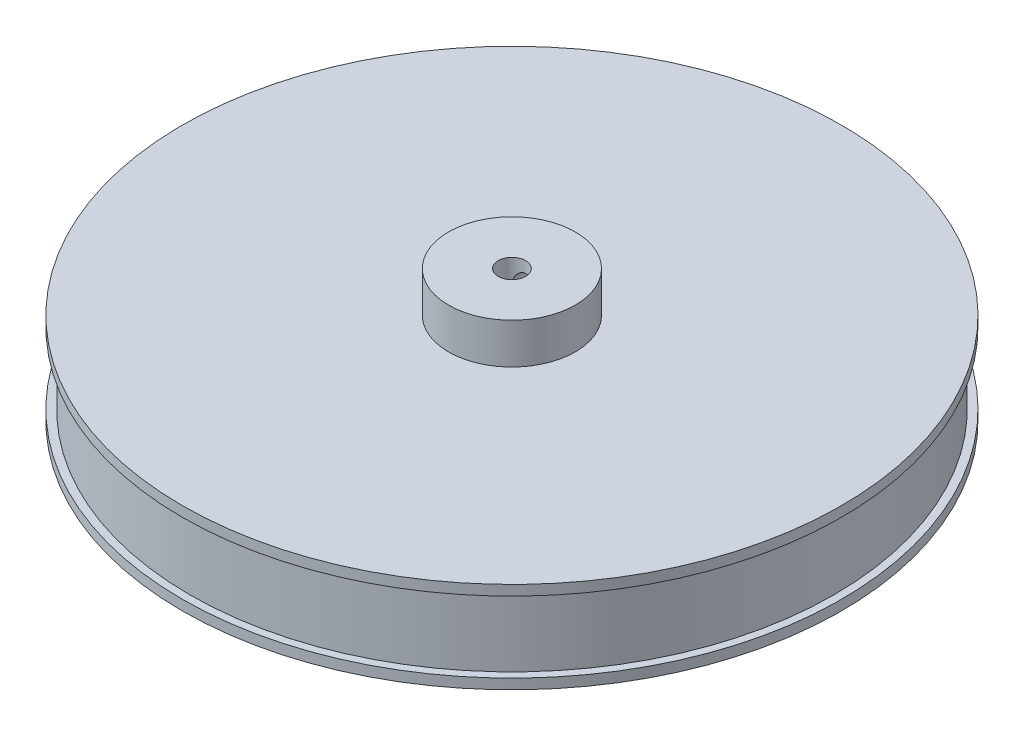
ISO-10303-21;
HEADER;
FILE_DESCRIPTION(('STEP AP214'),'2;1');
FILE_NAME('part.step','',(''),(''),'','','');
FILE_SCHEMA(('AUTOMOTIVE_DESIGN { 1 0 10303 214 1 1 1 1 }'));
ENDSEC;
DATA;
#1=APPLICATION_CONTEXT('core data for automotive mechanical design processes');
#2=APPLICATION_PROTOCOL_DEFINITION('international standard','automotive_design',2000,#1);
#3=PRODUCT_CONTEXT('',#1,'mechanical');
#4=PRODUCT('Part','Part','',(#3));
#5=PRODUCT_RELATED_PRODUCT_CATEGORY('part','',(#4));
#6=PRODUCT_DEFINITION_FORMATION('','',#4);
#7=PRODUCT_DEFINITION_CONTEXT('part definition',#1,'design');
#8=PRODUCT_DEFINITION('design','',#6,#7);
#9=PRODUCT_DEFINITION_SHAPE('','',#8);
#10=(LENGTH_UNIT() NAMED_UNIT(*) SI_UNIT(.MILLI.,.METRE.));
#11=(NAMED_UNIT(*) PLANE_ANGLE_UNIT() SI_UNIT($,.RADIAN.));
#12=(NAMED_UNIT(*) SI_UNIT($,.STERADIAN.) SOLID_ANGLE_UNIT());
#13=UNCERTAINTY_MEASURE_WITH_UNIT(LENGTH_MEASURE(1.E-05),#10,'distance_accuracy_value','');
#14=(GEOMETRIC_REPRESENTATION_CONTEXT(3) GLOBAL_UNCERTAINTY_ASSIGNED_CONTEXT((#13)) GLOBAL_UNIT_ASSIGNED_CONTEXT((#10,
#11,#12)) REPRESENTATION_CONTEXT('',''));
#15=CARTESIAN_POINT('',(0.,0.,0.));
#16=DIRECTION('',(0.,0.,1.));
#17=DIRECTION('',(1.,0.,0.));
#18=AXIS2_PLACEMENT_3D('',#15,#16,#17);
#19=CARTESIAN_POINT('',(0.,9.,0.));
#20=DIRECTION('',(0.,-1.,0.));
#21=DIRECTION('',(0.,0.,-1.));
#22=AXIS2_PLACEMENT_3D('',#19,#20,#21);
#23=CYLINDRICAL_SURFACE('',#22,32.5);
#24=CARTESIAN_POINT('',(0.,0.,0.));
#25=DIRECTION('',(0.,1.,0.));
#26=DIRECTION('',(0.,0.,1.));
#27=AXIS2_PLACEMENT_3D('',#24,#25,#26);
#28=CIRCLE('',#27,32.5);
#29=CARTESIAN_POINT('',(0.,0.,32.5));
#30=VERTEX_POINT('',#29);
#31=EDGE_CURVE('E56',#30,#30,#28,.T.);
#32=ORIENTED_EDGE('',*,*,#31,.T.);
#33=EDGE_LOOP('',(#32));
#34=FACE_BOUND('',#33,.T.);
#35=CARTESIAN_POINT('',(0.,1.,0.));
#36=DIRECTION('',(0.,1.,0.));
#37=DIRECTION('',(0.,0.,1.));
#38=AXIS2_PLACEMENT_3D('',#35,#36,#37);
#39=CIRCLE('',#38,32.5);
#40=CARTESIAN_POINT('',(0.,1.,32.5));
#41=VERTEX_POINT('',#40);
#42=EDGE_CURVE('E74',#41,#41,#39,.T.);
#43=ORIENTED_EDGE('',*,*,#42,.F.);
#44=EDGE_LOOP('',(#43));
#45=FACE_BOUND('',#44,.T.);
#46=ADVANCED_FACE('F44',(#34,#45),#23,.T.);
#47=CARTESIAN_POINT('',(0.,9.,0.));
#48=DIRECTION('',(0.,1.,0.));
#49=DIRECTION('',(0.,0.,1.));
#50=AXIS2_PLACEMENT_3D('',#47,#48,#49);
#51=CIRCLE('',#50,32.5);
#52=CARTESIAN_POINT('',(0.,9.,32.5));
#53=VERTEX_POINT('',#52);
#54=EDGE_CURVE('E11',#53,#53,#51,.T.);
#55=ORIENTED_EDGE('',*,*,#54,.F.);
#56=EDGE_LOOP('',(#55));
#57=FACE_BOUND('',#56,.T.);
#58=CARTESIAN_POINT('',(0.,8.,0.));
#59=DIRECTION('',(0.,1.,0.));
#60=DIRECTION('',(0.,0.,1.));
#61=AXIS2_PLACEMENT_3D('',#58,#59,#60);
#62=CIRCLE('',#61,32.5);
#63=CARTESIAN_POINT('',(0.,8.,32.5));
#64=VERTEX_POINT('',#63);
#65=EDGE_CURVE('E83',#64,#64,#62,.T.);
#66=ORIENTED_EDGE('',*,*,#65,.T.);
#67=EDGE_LOOP('',(#66));
#68=FACE_BOUND('',#67,.T.);
#69=ADVANCED_FACE('F125',(#57,#68),#23,.T.);
#70=CARTESIAN_POINT('',(0.,9.,0.));
#71=DIRECTION('',(0.,1.,0.));
#72=DIRECTION('',(0.,0.,1.));
#73=AXIS2_PLACEMENT_3D('',#70,#71,#72);
#74=PLANE('',#73);
#75=ORIENTED_EDGE('',*,*,#54,.T.);
#76=EDGE_LOOP('',(#75));
#77=FACE_BOUND('',#76,.T.);
#78=CARTESIAN_POINT('',(0.,9.,0.));
#79=DIRECTION('',(0.,1.,0.));
#80=DIRECTION('',(0.,0.,1.));
#81=AXIS2_PLACEMENT_3D('',#78,#79,#80);
#82=CIRCLE('',#81,6.25);
#83=CARTESIAN_POINT('',(0.,9.,6.25));
#84=VERTEX_POINT('',#83);
#85=EDGE_CURVE('E66',#84,#84,#82,.T.);
#86=ORIENTED_EDGE('',*,*,#85,.F.);
#87=EDGE_LOOP('',(#86));
#88=FACE_BOUND('',#87,.T.);
#89=ADVANCED_FACE('F130',(#77,#88),#74,.T.);
#90=CARTESIAN_POINT('',(0.,0.,0.));
#91=DIRECTION('',(0.,1.,0.));
#92=DIRECTION('',(0.,0.,1.));
#93=AXIS2_PLACEMENT_3D('',#90,#91,#92);
#94=PLANE('',#93);
#95=ORIENTED_EDGE('',*,*,#31,.F.);
#96=EDGE_LOOP('',(#95));
#97=FACE_BOUND('',#96,.T.);
#98=CARTESIAN_POINT('',(0.,0.,0.));
#99=DIRECTION('',(0.,1.,0.));
#100=DIRECTION('',(0.,0.,1.));
#101=AXIS2_PLACEMENT_3D('',#98,#99,#100);
#102=CIRCLE('',#101,1.35);
#103=CARTESIAN_POINT('',(0.,0.,1.35));
#104=VERTEX_POINT('',#103);
#105=EDGE_CURVE('E61',#104,#104,#102,.T.);
#106=ORIENTED_EDGE('',*,*,#105,.T.);
#107=EDGE_LOOP('',(#106));
#108=FACE_BOUND('',#107,.T.);
#109=ADVANCED_FACE('F143',(#97,#108),#94,.F.);
#110=CARTESIAN_POINT('',(0.,9.,0.));
#111=DIRECTION('',(0.,-1.,0.));
#112=DIRECTION('',(0.,0.,-1.));
#113=AXIS2_PLACEMENT_3D('',#110,#111,#112);
#114=CYLINDRICAL_SURFACE('',#113,1.35);
#115=CARTESIAN_POINT('',(0.,11.9,-1.35));
#116=CARTESIAN_POINT('',(-0.0452181225006576,11.9000002473346,-1.35000018740173));
#117=CARTESIAN_POINT('',(-0.0904360892098116,11.89657371352,-1.34770861239023));
#118=CARTESIAN_POINT('',(-0.17942987611425,11.8830814111524,-1.33877093590715));
#119=CARTESIAN_POINT('',(-0.223205001279751,11.8730124905945,-1.33212276711556));
#120=CARTESIAN_POINT('',(-0.307895538534414,11.8468515272038,-1.31512717082118));
#121=CARTESIAN_POINT('',(-0.3488232926959,11.8307876869964,-1.30479707471992));
#122=CARTESIAN_POINT('',(-0.427236880948767,11.7933214865278,-1.28126762044848));
#123=CARTESIAN_POINT('',(-0.464722214224351,11.7719183511647,-1.26806784572479));
#124=CARTESIAN_POINT('',(-0.53877811534655,11.7224043781847,-1.23852298216427));
#125=CARTESIAN_POINT('',(-0.575001137457305,11.6938784626657,-1.22200603910694));
#126=CARTESIAN_POINT('',(-0.642477620111733,11.6319214781037,-1.1879204088756));
#127=CARTESIAN_POINT('',(-0.673723824947495,11.598483381573,-1.17035023660574));
#128=CARTESIAN_POINT('',(-0.735400339854732,11.5215264345743,-1.13277719105458));
#129=CARTESIAN_POINT('',(-0.764924338632379,11.4772494560585,-1.11282780572009));
#130=CARTESIAN_POINT('',(-0.816076606563781,11.3832364800591,-1.07587866308767));
#131=CARTESIAN_POINT('',(-0.837718530419244,11.3335101192967,-1.05887383179594));
#132=CARTESIAN_POINT('',(-0.867033157551482,11.2444799179603,-1.03489319988662));
#133=CARTESIAN_POINT('',(-0.876935012562073,11.2063121962068,-1.02643932551596));
#134=CARTESIAN_POINT('',(-0.89167778003349,11.1283649728662,-1.01366086346807));
#135=CARTESIAN_POINT('',(-0.896527415933694,11.0885883730731,-1.00932915934812));
#136=CARTESIAN_POINT('',(-0.900861138635664,11.0083363495147,-1.00546472523675));
#137=CARTESIAN_POINT('',(-0.900323293129382,10.967858739447,-1.0059516115153));
#138=CARTESIAN_POINT('',(-0.893869115999575,10.8876642619246,-1.01168898967337));
#139=CARTESIAN_POINT('',(-0.887948227709805,10.8479480680853,-1.01694351728333));
#140=CARTESIAN_POINT('',(-0.87149247397984,10.7720898269431,-1.03107233696212));
#141=CARTESIAN_POINT('',(-0.861172701664503,10.7358673988346,-1.03977669748638));
#142=CARTESIAN_POINT('',(-0.836415533618551,10.6656393390538,-1.05979330317461));
#143=CARTESIAN_POINT('',(-0.82197678295292,10.6316344413662,-1.07110640624749));
#144=CARTESIAN_POINT('',(-0.786032184328487,10.559438572123,-1.09783888381991));
#145=CARTESIAN_POINT('',(-0.763686235479458,10.5218030449153,-1.11362543032056));
#146=CARTESIAN_POINT('',(-0.714010322102876,10.4503774722573,-1.14611192030235));
#147=CARTESIAN_POINT('',(-0.686674210536304,10.4165922540466,-1.16281297233852));
#148=CARTESIAN_POINT('',(-0.620915243903739,10.34635585443,-1.19944504675886));
#149=CARTESIAN_POINT('',(-0.581372722264049,10.3108996780799,-1.21929635119522));
#150=CARTESIAN_POINT('',(-0.49590359959843,10.2470615774706,-1.25648145304071));
#151=CARTESIAN_POINT('',(-0.44998303470765,10.2186730345691,-1.27381759942756));
#152=CARTESIAN_POINT('',(-0.36218602219104,10.1749350266172,-1.3011543183975));
#153=CARTESIAN_POINT('',(-0.321280939516711,10.1581204864968,-1.3119266752425));
#154=CARTESIAN_POINT('',(-0.236716219771616,10.1305527834692,-1.32978473563967));
#155=CARTESIAN_POINT('',(-0.193058945550942,10.1197944977907,-1.33687355457453));
#156=CARTESIAN_POINT('',(-0.103943453927328,10.1048774756427,-1.34674146970505));
#157=CARTESIAN_POINT('',(-0.0584783153702278,10.1007472425778,-1.34950195107544));
#158=CARTESIAN_POINT('',(0.0325986837250606,10.099438810147,-1.35037401734306));
#159=CARTESIAN_POINT('',(0.0782105337836021,10.1022601247799,-1.34848592723436));
#160=CARTESIAN_POINT('',(0.164905072742258,10.114230825003,-1.34054815241015));
#161=CARTESIAN_POINT('',(0.206080850106868,10.1229217839905,-1.33480010875949));
#162=CARTESIAN_POINT('',(0.286252376591097,10.1457180587052,-1.31993302177829));
#163=CARTESIAN_POINT('',(0.325247776902431,10.1598242379153,-1.31081344084846));
#164=CARTESIAN_POINT('',(0.402599137714553,10.1938935336727,-1.28923358639498));
#165=CARTESIAN_POINT('',(0.440773283102763,10.2141596693465,-1.27660441566389));
#166=CARTESIAN_POINT('',(0.513307360762144,10.2594949804662,-1.24920835019891));
#167=CARTESIAN_POINT('',(0.547664916620701,10.2845671222033,-1.23444013661991));
#168=CARTESIAN_POINT('',(0.617334504754488,10.3432735407155,-1.20129546016797));
#169=CARTESIAN_POINT('',(0.651938344392606,10.3776348172076,-1.1827177065154));
#170=CARTESIAN_POINT('',(0.715202856615432,10.4515001436282,-1.14557027969593));
#171=CARTESIAN_POINT('',(0.743859421488218,10.4910077175899,-1.12700062089573));
#172=CARTESIAN_POINT('',(0.792561494440452,10.5712140857479,-1.09322855535582));
#173=CARTESIAN_POINT('',(0.813130362704051,10.6115294151997,-1.07787418724401));
#174=CARTESIAN_POINT('',(0.848232962008492,10.6957426937617,-1.05047538491786));
#175=CARTESIAN_POINT('',(0.862777555613303,10.7396340222804,-1.03842500655803));
#176=CARTESIAN_POINT('',(0.883061295559844,10.8220540192083,-1.02119943667805));
#177=CARTESIAN_POINT('',(0.889913689039721,10.860127314436,-1.01517749105918));
#178=CARTESIAN_POINT('',(0.898646426663458,10.9372579766015,-1.00745759900923));
#179=CARTESIAN_POINT('',(0.900532171282927,10.9763142280161,-1.00575495606736));
#180=CARTESIAN_POINT('',(0.899207648916697,11.0542893755224,-1.00693890517272));
#181=CARTESIAN_POINT('',(0.895994364467314,11.0932081766133,-1.00982821461129));
#182=CARTESIAN_POINT('',(0.884686487499051,11.1698045878444,-1.01974703578796));
#183=CARTESIAN_POINT('',(0.876585382728908,11.2074804712374,-1.02678207076101));
#184=CARTESIAN_POINT('',(0.853168660520649,11.2905700338929,-1.04637079771435));
#185=CARTESIAN_POINT('',(0.836505842347787,11.3353704707326,-1.0598955016914));
#186=CARTESIAN_POINT('',(0.796880368327395,11.4209690753805,-1.08999972566247));
#187=CARTESIAN_POINT('',(0.773908867606882,11.4617615140716,-1.10658352375695));
#188=CARTESIAN_POINT('',(0.721792262425191,11.5396768492371,-1.14127733942752));
#189=CARTESIAN_POINT('',(0.692542394503446,11.5767194354473,-1.15940964321963));
#190=CARTESIAN_POINT('',(0.628522956159581,11.6458951152091,-1.19532735696594));
#191=CARTESIAN_POINT('',(0.593751694621459,11.6780266986612,-1.21311265875876));
#192=CARTESIAN_POINT('',(0.513655798389994,11.7410204469413,-1.24934198382353));
#193=CARTESIAN_POINT('',(0.467532751298392,11.7710383880808,-1.26751412452102));
#194=CARTESIAN_POINT('',(0.369390850098745,11.8225609744988,-1.29949949643766));
#195=CARTESIAN_POINT('',(0.317381428102524,11.8440789980706,-1.31331957050458));
#196=CARTESIAN_POINT('',(0.221145781425776,11.8735195601738,-1.3324574017653));
#197=CARTESIAN_POINT('',(0.177755546365983,11.8833999675944,-1.33898166166001));
#198=CARTESIAN_POINT('',(0.0895761054108604,11.8966376146421,-1.34775126063853));
#199=CARTESIAN_POINT('',(0.0447879762846266,11.8999997550182,-1.34999981438097));
#200=CARTESIAN_POINT('',(0.,11.9,-1.35));
#201=B_SPLINE_CURVE_WITH_KNOTS('',3,(#115,#116,#117,#118,#119,#120,#121,#122,#123,#124,#125,
#126,#127,#128,#129,#130,#131,#132,#133,#134,#135,#136,#137,#138,#139,#140,#141,#142,#143,#144,
#145,#146,#147,#148,#149,#150,#151,#152,#153,#154,#155,#156,#157,#158,#159,#160,#161,#162,#163,
#164,#165,#166,#167,#168,#169,#170,#171,#172,#173,#174,#175,#176,#177,#178,#179,#180,#181,#182,
#183,#184,#185,#186,#187,#188,#189,#190,#191,#192,#193,#194,#195,#196,#197,#198,#199,#200),
.UNSPECIFIED.,.T.,.F.,(4,2,2,2,2,2,2,2,2,2,2,2,2,2,2,2,2,2,2,2,2,2,2,2,2,2,2,2,2,2,2,2,2,2,2,2,
2,2,2,2,2,2,4),(0.,0.13547395192743,0.27101223645691,0.405920768935604,0.54084889740324,
0.687226630502506,0.833815852219433,1.00353007483192,1.17294887450447,1.29345162154213,
1.41374595530614,1.5345302028092,1.65541678768508,1.7709698798911,1.88656102712285,
2.02566408596817,2.16493966700291,2.33423529522804,2.50337178134878,2.63935839462806,
2.77522980813531,2.91168397481678,3.04812860189302,3.17498888155878,3.30186939811487,
3.43643556072547,3.57108504724607,3.72702679264224,3.88307588930298,4.02592470886672,
4.16851481985717,4.28545821604652,4.40227440147283,4.51915974125438,4.63620115730971,
4.78442973913351,4.9328672101627,5.08400660338209,5.23519237782759,5.40807908197664,
5.58069257948562,5.71497881111226,5.84916404062996),.UNSPECIFIED.);
#202=CARTESIAN_POINT('',(0.,11.9,-1.35));
#203=VERTEX_POINT('',#202);
#204=EDGE_CURVE('E86',#203,#203,#201,.T.);
#205=ORIENTED_EDGE('',*,*,#204,.F.);
#206=EDGE_LOOP('',(#205));
#207=FACE_BOUND('',#206,.T.);
#208=ORIENTED_EDGE('',*,*,#105,.F.);
#209=EDGE_LOOP('',(#208));
#210=FACE_BOUND('',#209,.T.);
#211=CARTESIAN_POINT('',(0.,13.,0.));
#212=DIRECTION('',(0.,1.,0.));
#213=DIRECTION('',(0.,0.,1.));
#214=AXIS2_PLACEMENT_3D('',#211,#212,#213);
#215=CIRCLE('',#214,1.35);
#216=CARTESIAN_POINT('',(0.,13.,1.35));
#217=VERTEX_POINT('',#216);
#218=EDGE_CURVE('E69',#217,#217,#215,.T.);
#219=ORIENTED_EDGE('',*,*,#218,.T.);
#220=EDGE_LOOP('',(#219));
#221=FACE_BOUND('',#220,.T.);
#222=ADVANCED_FACE('F92',(#207,#210,#221),#114,.F.);
#223=CARTESIAN_POINT('',(0.,13.,0.));
#224=DIRECTION('',(0.,1.,0.));
#225=DIRECTION('',(0.,0.,1.));
#226=AXIS2_PLACEMENT_3D('',#223,#224,#225);
#227=PLANE('',#226);
#228=CARTESIAN_POINT('',(0.,13.,0.));
#229=DIRECTION('',(0.,1.,0.));
#230=DIRECTION('',(0.,0.,1.));
#231=AXIS2_PLACEMENT_3D('',#228,#229,#230);
#232=CIRCLE('',#231,6.25);
#233=CARTESIAN_POINT('',(0.,13.,6.25));
#234=VERTEX_POINT('',#233);
#235=EDGE_CURVE('E65',#234,#234,#232,.T.);
#236=ORIENTED_EDGE('',*,*,#235,.T.);
#237=EDGE_LOOP('',(#236));
#238=FACE_BOUND('',#237,.T.);
#239=ORIENTED_EDGE('',*,*,#218,.F.);
#240=EDGE_LOOP('',(#239));
#241=FACE_BOUND('',#240,.T.);
#242=ADVANCED_FACE('F114',(#238,#241),#227,.T.);
#243=CARTESIAN_POINT('',(0.,13.,0.));
#244=DIRECTION('',(0.,-1.,0.));
#245=DIRECTION('',(0.,0.,-1.));
#246=AXIS2_PLACEMENT_3D('',#243,#244,#245);
#247=CYLINDRICAL_SURFACE('',#246,6.25);
#248=CARTESIAN_POINT('',(0.,11.9,-6.25));
#249=CARTESIAN_POINT('',(-0.0502744525266471,11.8999979093786,-6.2499992172363));
#250=CARTESIAN_POINT('',(-0.100578653749475,11.8957732485634,-6.24938702512503));
#251=CARTESIAN_POINT('',(-0.199782588081479,11.8789895896318,-6.24700377932593));
#252=CARTESIAN_POINT('',(-0.248680878057715,11.8664223258072,-6.24523157634355));
#253=CARTESIAN_POINT('',(-0.343622822896581,11.833335400564,-6.24072759090386));
#254=CARTESIAN_POINT('',(-0.389668546498302,11.8128215823492,-6.237996513657));
#255=CARTESIAN_POINT('',(-0.477656609154213,11.7644377730686,-6.23187706523765));
#256=CARTESIAN_POINT('',(-0.519599550931973,11.7365688647414,-6.22848879083021));
#257=CARTESIAN_POINT('',(-0.598501867361852,11.6740513255571,-6.22140475555379));
#258=CARTESIAN_POINT('',(-0.635427316962555,11.6393600829429,-6.21770715063385));
#259=CARTESIAN_POINT('',(-0.702953898878415,11.5642742972169,-6.21043574054593));
#260=CARTESIAN_POINT('',(-0.733554678557828,11.5238794363075,-6.20686194229012));
#261=CARTESIAN_POINT('',(-0.787693959272984,11.4383069446898,-6.20022484801927));
#262=CARTESIAN_POINT('',(-0.811199890542981,11.3931085072528,-6.19716393419558));
#263=CARTESIAN_POINT('',(-0.850274127584972,11.2993538289931,-6.19192417148538));
#264=CARTESIAN_POINT('',(-0.865842831851493,11.2507977568821,-6.18974527831747));
#265=CARTESIAN_POINT('',(-0.888495864194482,11.1520618503964,-6.18653428086729));
#266=CARTESIAN_POINT('',(-0.895638088244336,11.1018955580955,-6.18549435464947));
#267=CARTESIAN_POINT('',(-0.901414722947187,11.0010665408343,-6.18465524832384));
#268=CARTESIAN_POINT('',(-0.900049584371349,10.9504038423187,-6.18485600247732));
#269=CARTESIAN_POINT('',(-0.888897612112955,10.8504277055103,-6.1864684191811));
#270=CARTESIAN_POINT('',(-0.879175077467591,10.8011069243795,-6.18787083627294));
#271=CARTESIAN_POINT('',(-0.851684868923508,10.7048041706754,-6.19171412647823));
#272=CARTESIAN_POINT('',(-0.833916983826847,10.6578222595355,-6.19415502685274));
#273=CARTESIAN_POINT('',(-0.790772994441439,10.567334202395,-6.19981053963533));
#274=CARTESIAN_POINT('',(-0.765369474585945,10.5238413087561,-6.20302793167463));
#275=CARTESIAN_POINT('',(-0.70769487459961,10.4417112913257,-6.20987186751316));
#276=CARTESIAN_POINT('',(-0.675423378607495,10.4030744617981,-6.2134984360821));
#277=CARTESIAN_POINT('',(-0.604575076268361,10.3313805309419,-6.22079301969416));
#278=CARTESIAN_POINT('',(-0.565942951029441,10.2983780790415,-6.22446110890819));
#279=CARTESIAN_POINT('',(-0.483659046715392,10.2393170121483,-6.23139436742521));
#280=CARTESIAN_POINT('',(-0.440007248661981,10.2132584234097,-6.23465953520475));
#281=CARTESIAN_POINT('',(-0.34887708309577,10.1688226937102,-6.24042208813781));
#282=CARTESIAN_POINT('',(-0.301396732050415,10.1504495654017,-6.24291907203564));
#283=CARTESIAN_POINT('',(-0.203980595168062,10.1219527507669,-6.24686049998903));
#284=CARTESIAN_POINT('',(-0.154044962406732,10.111828550847,-6.24830500957298));
#285=CARTESIAN_POINT('',(-0.0536076332477414,10.1001891790192,-6.24997009555528));
#286=CARTESIAN_POINT('',(-0.00311481856892019,10.0985988372916,-6.25020135833704));
#287=CARTESIAN_POINT('',(0.0974167294708152,10.1038730962774,-6.24944292258583));
#288=CARTESIAN_POINT('',(0.147455475715799,10.1107374563305,-6.24845325880614));
#289=CARTESIAN_POINT('',(0.245432286999156,10.1326637695546,-6.24537078503489));
#290=CARTESIAN_POINT('',(0.293378670592155,10.1476892998684,-6.24328287774188));
#291=CARTESIAN_POINT('',(0.386071568053221,10.1854731635882,-6.23823735714449));
#292=CARTESIAN_POINT('',(0.4308179418643,10.2082318352053,-6.23527970580237));
#293=CARTESIAN_POINT('',(0.516172506344649,10.2610137086846,-6.22879704327392));
#294=CARTESIAN_POINT('',(0.55675077564856,10.2910848356327,-6.22526834274267));
#295=CARTESIAN_POINT('',(0.63231145441944,10.3575710138812,-6.21804837806977));
#296=CARTESIAN_POINT('',(0.667293565243279,10.3939864035314,-6.21435710526574));
#297=CARTESIAN_POINT('',(0.730940695355225,10.4724611731579,-6.20719437010392));
#298=CARTESIAN_POINT('',(0.759555465044417,10.5145615069201,-6.20372480034412));
#299=CARTESIAN_POINT('',(0.809306915221253,10.6030152206092,-6.19743122780082));
#300=CARTESIAN_POINT('',(0.830443785057587,10.6493684928095,-6.19460720867191));
#301=CARTESIAN_POINT('',(0.864560660009936,10.7448593051849,-6.18993799576113));
#302=CARTESIAN_POINT('',(0.877567590231668,10.7939870608479,-6.18808957414975));
#303=CARTESIAN_POINT('',(0.895141342589654,10.8937581721102,-6.18557209268067));
#304=CARTESIAN_POINT('',(0.899708698106628,10.9444014317243,-6.18490295829221));
#305=CARTESIAN_POINT('',(0.900261701969885,11.0452653878394,-6.18482244544164));
#306=CARTESIAN_POINT('',(0.89632633857913,11.0954856599904,-6.18539949024417));
#307=CARTESIAN_POINT('',(0.880154370409432,11.1945424258775,-6.18772122747442));
#308=CARTESIAN_POINT('',(0.86791777490406,11.2433789211594,-6.18946591859772));
#309=CARTESIAN_POINT('',(0.835517818797984,11.338262874836,-6.19392243761729));
#310=CARTESIAN_POINT('',(0.815359544985624,11.384312101179,-6.19663364477609));
#311=CARTESIAN_POINT('',(0.767696260605872,11.4723875640472,-6.20271852861478));
#312=CARTESIAN_POINT('',(0.740191040832339,11.5144136859672,-6.20609222415848));
#313=CARTESIAN_POINT('',(0.678326034719943,11.5936519726005,-6.21315933678338));
#314=CARTESIAN_POINT('',(0.643907634779107,11.6308181505687,-6.21685532344926));
#315=CARTESIAN_POINT('',(0.569317010813329,11.6988757838905,-6.22412879992186));
#316=CARTESIAN_POINT('',(0.52914344704638,11.7297657741528,-6.22770626189785));
#317=CARTESIAN_POINT('',(0.443945182259829,11.7845322784803,-6.2343601217583));
#318=CARTESIAN_POINT('',(0.398896990295943,11.8083725583284,-6.23743389595291));
#319=CARTESIAN_POINT('',(0.305413936434655,11.8481135197873,-6.24270817607015));
#320=CARTESIAN_POINT('',(0.256982687708524,11.8640225286939,-6.24490959740357));
#321=CARTESIAN_POINT('',(0.173604386409467,11.8837887930361,-6.24768134438965));
#322=CARTESIAN_POINT('',(0.139175065313988,11.889858849272,-6.24854643417513));
#323=CARTESIAN_POINT('',(0.0698352780342491,11.8979651567125,-6.24970603072633));
#324=CARTESIAN_POINT('',(0.0349248171504868,11.9000014523196,-6.25000054377279));
#325=CARTESIAN_POINT('',(0.,11.9,-6.25));
#326=B_SPLINE_CURVE_WITH_KNOTS('',3,(#248,#249,#250,#251,#252,#253,#254,#255,#256,#257,#258,
#259,#260,#261,#262,#263,#264,#265,#266,#267,#268,#269,#270,#271,#272,#273,#274,#275,#276,#277,
#278,#279,#280,#281,#282,#283,#284,#285,#286,#287,#288,#289,#290,#291,#292,#293,#294,#295,#296,
#297,#298,#299,#300,#301,#302,#303,#304,#305,#306,#307,#308,#309,#310,#311,#312,#313,#314,#315,
#316,#317,#318,#319,#320,#321,#322,#323,#324,#325),.UNSPECIFIED.,.T.,.F.,(4,2,2,2,2,2,2,2,2,2,2,
2,2,2,2,2,2,2,2,2,2,2,2,2,2,2,2,2,2,2,2,2,2,2,2,2,2,2,4),(0.,0.150695751625978,0.30154103331002,
0.452275606419351,0.60298800234297,0.754673478315772,0.906367409322622,1.05874747395301,
1.21111988747265,1.36243918078519,1.51375045636098,1.66390790743321,1.81406930050692,
1.96477641903575,2.11549266559503,2.26759659667132,2.41970110283814,2.57188492539924,
2.72405927199091,2.87489097553063,3.02571838579406,3.17587812726568,3.32604443686282,
3.47722278157563,3.62840919134301,3.78074945443196,3.9330858598209,4.08491503950494,
4.23673462326383,4.38714990685448,4.5375650224117,4.6878837085449,4.83820667549701,
4.98986247880404,5.14155364353916,5.29401143653477,5.44630882030727,5.55099577841548,
5.65568158415554),.UNSPECIFIED.);
#327=CARTESIAN_POINT('',(0.,11.9,-6.25));
#328=VERTEX_POINT('',#327);
#329=EDGE_CURVE('E47',#328,#328,#326,.T.);
#330=ORIENTED_EDGE('',*,*,#329,.T.);
#331=EDGE_LOOP('',(#330));
#332=FACE_BOUND('',#331,.T.);
#333=ORIENTED_EDGE('',*,*,#235,.F.);
#334=EDGE_LOOP('',(#333));
#335=FACE_BOUND('',#334,.T.);
#336=ORIENTED_EDGE('',*,*,#85,.T.);
#337=EDGE_LOOP('',(#336));
#338=FACE_BOUND('',#337,.T.);
#339=ADVANCED_FACE('F112',(#332,#335,#338),#247,.T.);
#340=CARTESIAN_POINT('',(32.5,1.,0.));
#341=DIRECTION('',(0.,1.,0.));
#342=DIRECTION('',(0.,0.,1.));
#343=AXIS2_PLACEMENT_3D('',#340,#341,#342);
#344=PLANE('',#343);
#345=ORIENTED_EDGE('',*,*,#42,.T.);
#346=EDGE_LOOP('',(#345));
#347=FACE_BOUND('',#346,.T.);
#348=CARTESIAN_POINT('',(0.,0.999999999999999,0.));
#349=DIRECTION('',(0.,1.,0.));
#350=DIRECTION('',(0.,0.,1.));
#351=AXIS2_PLACEMENT_3D('',#348,#349,#350);
#352=CIRCLE('',#351,31.75);
#353=CARTESIAN_POINT('',(0.,0.999999999999999,31.75));
#354=VERTEX_POINT('',#353);
#355=EDGE_CURVE('E77',#354,#354,#352,.T.);
#356=ORIENTED_EDGE('',*,*,#355,.F.);
#357=EDGE_LOOP('',(#356));
#358=FACE_BOUND('',#357,.T.);
#359=ADVANCED_FACE('F108',(#347,#358),#344,.T.);
#360=CARTESIAN_POINT('',(0.,13.,0.));
#361=DIRECTION('',(0.,1.,0.));
#362=DIRECTION('',(0.,0.,1.));
#363=AXIS2_PLACEMENT_3D('',#360,#361,#362);
#364=CYLINDRICAL_SURFACE('',#363,31.75);
#365=ORIENTED_EDGE('',*,*,#355,.T.);
#366=EDGE_LOOP('',(#365));
#367=FACE_BOUND('',#366,.T.);
#368=CARTESIAN_POINT('',(0.,8.,0.));
#369=DIRECTION('',(0.,1.,0.));
#370=DIRECTION('',(0.,0.,1.));
#371=AXIS2_PLACEMENT_3D('',#368,#369,#370);
#372=CIRCLE('',#371,31.75);
#373=CARTESIAN_POINT('',(0.,8.,31.75));
#374=VERTEX_POINT('',#373);
#375=EDGE_CURVE('E80',#374,#374,#372,.T.);
#376=ORIENTED_EDGE('',*,*,#375,.F.);
#377=EDGE_LOOP('',(#376));
#378=FACE_BOUND('',#377,.T.);
#379=ADVANCED_FACE('F104',(#367,#378),#364,.T.);
#380=CARTESIAN_POINT('',(32.5,8.,0.));
#381=DIRECTION('',(0.,-1.,0.));
#382=DIRECTION('',(0.,0.,-1.));
#383=AXIS2_PLACEMENT_3D('',#380,#381,#382);
#384=PLANE('',#383);
#385=ORIENTED_EDGE('',*,*,#375,.T.);
#386=EDGE_LOOP('',(#385));
#387=FACE_BOUND('',#386,.T.);
#388=ORIENTED_EDGE('',*,*,#65,.F.);
#389=EDGE_LOOP('',(#388));
#390=FACE_BOUND('',#389,.T.);
#391=ADVANCED_FACE('F99',(#387,#390),#384,.T.);
#392=CARTESIAN_POINT('',(0.,11.,-10.));
#393=DIRECTION('',(0.,0.,1.));
#394=DIRECTION('',(1.,0.,0.));
#395=AXIS2_PLACEMENT_3D('',#392,#393,#394);
#396=CYLINDRICAL_SURFACE('',#395,0.9);
#397=ORIENTED_EDGE('',*,*,#204,.T.);
#398=EDGE_LOOP('',(#397));
#399=FACE_BOUND('',#398,.T.);
#400=ORIENTED_EDGE('',*,*,#329,.F.);
#401=EDGE_LOOP('',(#400));
#402=FACE_BOUND('',#401,.T.);
#403=ADVANCED_FACE('F95',(#399,#402),#396,.F.);
#404=CLOSED_SHELL('',(#46,#69,#89,#109,#222,#242,#339,#359,#379,#391,#403));
#405=MANIFOLD_SOLID_BREP('B2',#404);
#406=ADVANCED_BREP_SHAPE_REPRESENTATION('',(#18,#405),#14);
#407=SHAPE_DEFINITION_REPRESENTATION(#9,#406);
ENDSEC;
END-ISO-10303-21;
